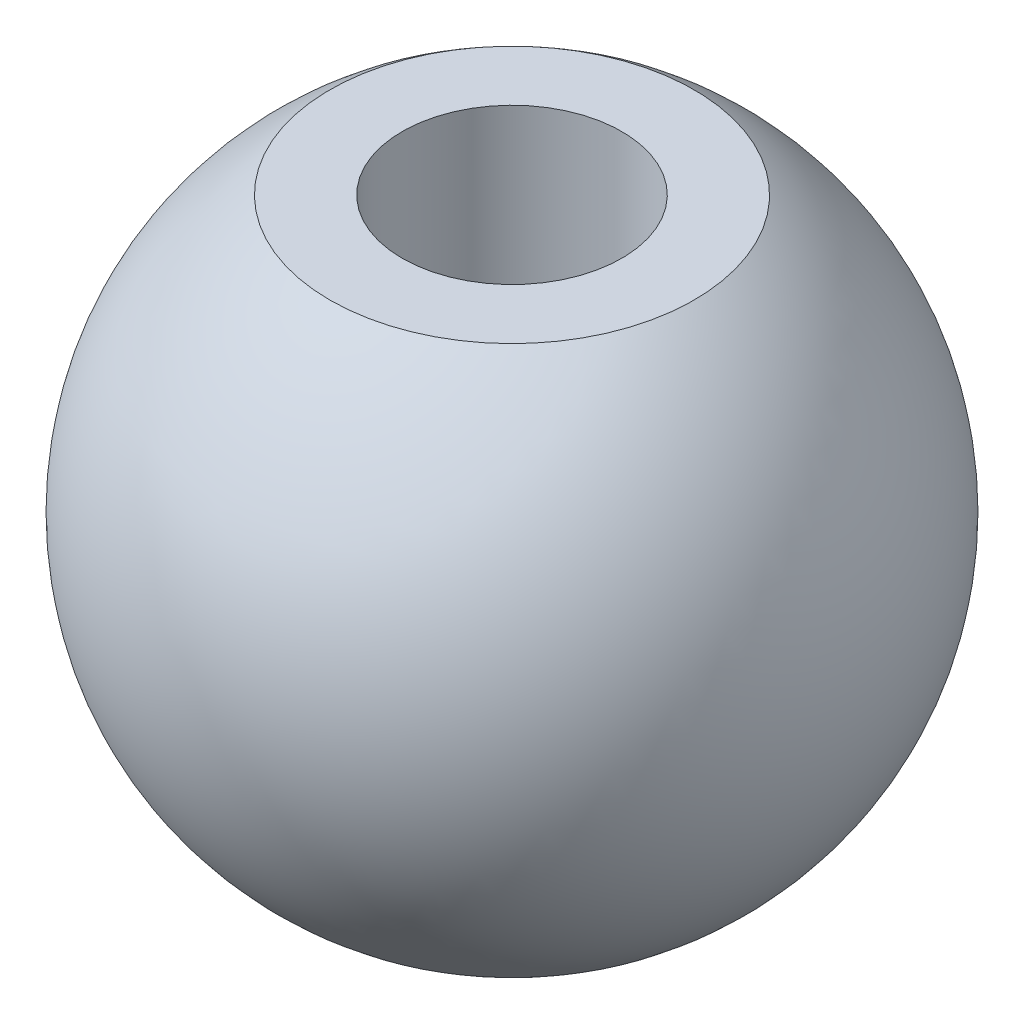
ISO-10303-21;
HEADER;
FILE_DESCRIPTION(('STEP AP214'),'2;1');
FILE_NAME('part.step','',(''),(''),'','','');
FILE_SCHEMA(('AUTOMOTIVE_DESIGN { 1 0 10303 214 1 1 1 1 }'));
ENDSEC;
DATA;
#1=APPLICATION_CONTEXT('core data for automotive mechanical design processes');
#2=APPLICATION_PROTOCOL_DEFINITION('international standard','automotive_design',2000,#1);
#3=PRODUCT_CONTEXT('',#1,'mechanical');
#4=PRODUCT('Part','Part','',(#3));
#5=PRODUCT_RELATED_PRODUCT_CATEGORY('part','',(#4));
#6=PRODUCT_DEFINITION_FORMATION('','',#4);
#7=PRODUCT_DEFINITION_CONTEXT('part definition',#1,'design');
#8=PRODUCT_DEFINITION('design','',#6,#7);
#9=PRODUCT_DEFINITION_SHAPE('','',#8);
#10=(LENGTH_UNIT() NAMED_UNIT(*) SI_UNIT(.MILLI.,.METRE.));
#11=(NAMED_UNIT(*) PLANE_ANGLE_UNIT() SI_UNIT($,.RADIAN.));
#12=(NAMED_UNIT(*) SI_UNIT($,.STERADIAN.) SOLID_ANGLE_UNIT());
#13=UNCERTAINTY_MEASURE_WITH_UNIT(LENGTH_MEASURE(1.E-05),#10,'distance_accuracy_value','');
#14=(GEOMETRIC_REPRESENTATION_CONTEXT(3) GLOBAL_UNCERTAINTY_ASSIGNED_CONTEXT((#13)) GLOBAL_UNIT_ASSIGNED_CONTEXT((#10,
#11,#12)) REPRESENTATION_CONTEXT('',''));
#15=CARTESIAN_POINT('',(0.,0.,0.));
#16=DIRECTION('',(0.,0.,1.));
#17=DIRECTION('',(1.,0.,0.));
#18=AXIS2_PLACEMENT_3D('',#15,#16,#17);
#19=CARTESIAN_POINT('',(0.,0.,0.));
#20=DIRECTION('',(0.,0.,-1.));
#21=DIRECTION('',(1.,0.,0.));
#22=AXIS2_PLACEMENT_3D('',#19,#20,#21);
#23=SPHERICAL_SURFACE('',#22,3.);
#24=CARTESIAN_POINT('',(0.,0.,0.));
#25=DIRECTION('',(0.,1.,0.));
#26=DIRECTION('',(0.,0.,1.));
#27=AXIS2_PLACEMENT_3D('',#24,#25,#26);
#28=SPHERICAL_SURFACE('',#27,3.);
#29=CARTESIAN_POINT('',(0.,2.5,0.));
#30=DIRECTION('',(0.,1.,0.));
#31=DIRECTION('',(0.,0.,1.));
#32=AXIS2_PLACEMENT_3D('',#29,#30,#31);
#33=CIRCLE('',#32,1.6583123951777);
#34=CARTESIAN_POINT('',(0.,2.5,1.6583123951777));
#35=VERTEX_POINT('',#34);
#36=EDGE_CURVE('E10',#35,#35,#33,.F.);
#37=ORIENTED_EDGE('',*,*,#36,.T.);
#38=EDGE_LOOP('',(#37));
#39=FACE_BOUND('',#38,.T.);
#40=CARTESIAN_POINT('',(0.,-2.5,0.));
#41=DIRECTION('',(0.,-1.,0.));
#42=DIRECTION('',(0.,0.,-1.));
#43=AXIS2_PLACEMENT_3D('',#40,#41,#42);
#44=CIRCLE('',#43,1.6583123951777);
#45=CARTESIAN_POINT('',(0.,-2.5,-1.6583123951777));
#46=VERTEX_POINT('',#45);
#47=EDGE_CURVE('E43',#46,#46,#44,.F.);
#48=ORIENTED_EDGE('',*,*,#47,.T.);
#49=EDGE_LOOP('',(#48));
#50=FACE_BOUND('',#49,.T.);
#51=ADVANCED_FACE('F32',(#39,#50),#28,.T.);
#52=CARTESIAN_POINT('',(0.,-7.5,0.));
#53=DIRECTION('',(0.,1.,0.));
#54=DIRECTION('',(0.,0.,1.));
#55=AXIS2_PLACEMENT_3D('',#52,#53,#54);
#56=CYLINDRICAL_SURFACE('',#55,1.);
#57=CARTESIAN_POINT('',(0.,2.5,0.));
#58=DIRECTION('',(0.,1.,0.));
#59=DIRECTION('',(0.,0.,1.));
#60=AXIS2_PLACEMENT_3D('',#57,#58,#59);
#61=CIRCLE('',#60,1.);
#62=CARTESIAN_POINT('',(0.,2.5,1.));
#63=VERTEX_POINT('',#62);
#64=EDGE_CURVE('E39',#63,#63,#61,.T.);
#65=ORIENTED_EDGE('',*,*,#64,.T.);
#66=EDGE_LOOP('',(#65));
#67=FACE_BOUND('',#66,.T.);
#68=CARTESIAN_POINT('',(0.,-2.5,0.));
#69=DIRECTION('',(0.,-1.,0.));
#70=DIRECTION('',(0.,0.,-1.));
#71=AXIS2_PLACEMENT_3D('',#68,#69,#70);
#72=CIRCLE('',#71,1.);
#73=CARTESIAN_POINT('',(0.,-2.5,-1.));
#74=VERTEX_POINT('',#73);
#75=EDGE_CURVE('E35',#74,#74,#72,.F.);
#76=ORIENTED_EDGE('',*,*,#75,.F.);
#77=EDGE_LOOP('',(#76));
#78=FACE_BOUND('',#77,.T.);
#79=ADVANCED_FACE('F54',(#67,#78),#56,.F.);
#80=CARTESIAN_POINT('',(0.,2.5,0.));
#81=DIRECTION('',(0.,1.,0.));
#82=DIRECTION('',(0.,0.,1.));
#83=AXIS2_PLACEMENT_3D('',#80,#81,#82);
#84=PLANE('',#83);
#85=ORIENTED_EDGE('',*,*,#64,.F.);
#86=EDGE_LOOP('',(#85));
#87=FACE_BOUND('',#86,.T.);
#88=ORIENTED_EDGE('',*,*,#36,.F.);
#89=EDGE_LOOP('',(#88));
#90=FACE_BOUND('',#89,.T.);
#91=ADVANCED_FACE('F56',(#87,#90),#84,.T.);
#92=CARTESIAN_POINT('',(0.,-2.5,0.));
#93=DIRECTION('',(0.,-1.,0.));
#94=DIRECTION('',(0.,0.,1.));
#95=AXIS2_PLACEMENT_3D('',#92,#93,#94);
#96=PLANE('',#95);
#97=ORIENTED_EDGE('',*,*,#47,.F.);
#98=EDGE_LOOP('',(#97));
#99=FACE_BOUND('',#98,.T.);
#100=ORIENTED_EDGE('',*,*,#75,.T.);
#101=EDGE_LOOP('',(#100));
#102=FACE_BOUND('',#101,.T.);
#103=ADVANCED_FACE('F52',(#99,#102),#96,.T.);
#104=CLOSED_SHELL('',(#51,#79,#91,#103));
#105=MANIFOLD_SOLID_BREP('B2',#104);
#106=ADVANCED_BREP_SHAPE_REPRESENTATION('',(#18,#105),#14);
#107=SHAPE_DEFINITION_REPRESENTATION(#9,#106);
ENDSEC;
END-ISO-10303-21;
